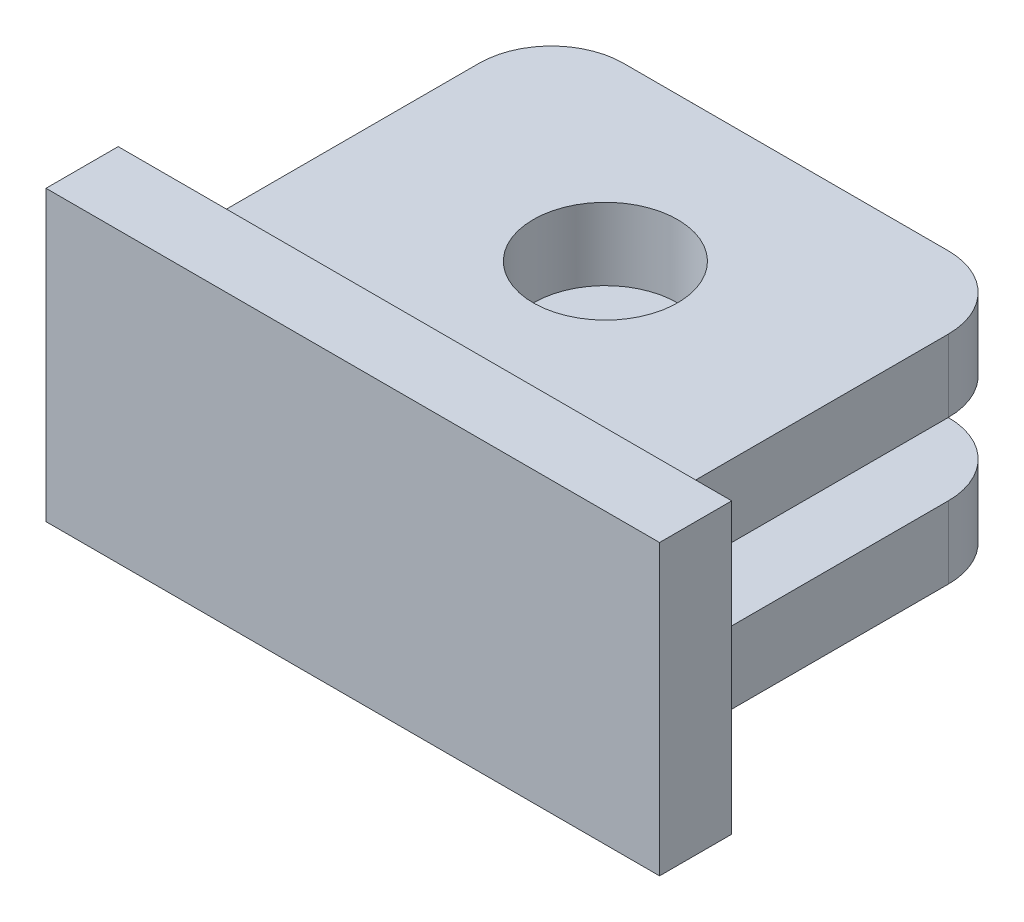
ISO-10303-21;
HEADER;
FILE_DESCRIPTION(('STEP AP214'),'2;1');
FILE_NAME('part.step','',(''),(''),'','','');
FILE_SCHEMA(('AUTOMOTIVE_DESIGN { 1 0 10303 214 1 1 1 1 }'));
ENDSEC;
DATA;
#1=APPLICATION_CONTEXT('core data for automotive mechanical design processes');
#2=APPLICATION_PROTOCOL_DEFINITION('international standard','automotive_design',2000,#1);
#3=PRODUCT_CONTEXT('',#1,'mechanical');
#4=PRODUCT('Part','Part','',(#3));
#5=PRODUCT_RELATED_PRODUCT_CATEGORY('part','',(#4));
#6=PRODUCT_DEFINITION_FORMATION('','',#4);
#7=PRODUCT_DEFINITION_CONTEXT('part definition',#1,'design');
#8=PRODUCT_DEFINITION('design','',#6,#7);
#9=PRODUCT_DEFINITION_SHAPE('','',#8);
#10=(LENGTH_UNIT() NAMED_UNIT(*) SI_UNIT(.MILLI.,.METRE.));
#11=(NAMED_UNIT(*) PLANE_ANGLE_UNIT() SI_UNIT($,.RADIAN.));
#12=(NAMED_UNIT(*) SI_UNIT($,.STERADIAN.) SOLID_ANGLE_UNIT());
#13=UNCERTAINTY_MEASURE_WITH_UNIT(LENGTH_MEASURE(1.E-05),#10,'distance_accuracy_value','');
#14=(GEOMETRIC_REPRESENTATION_CONTEXT(3) GLOBAL_UNCERTAINTY_ASSIGNED_CONTEXT((#13)) GLOBAL_UNIT_ASSIGNED_CONTEXT((#10,
#11,#12)) REPRESENTATION_CONTEXT('',''));
#15=CARTESIAN_POINT('',(0.,0.,0.));
#16=DIRECTION('',(0.,0.,1.));
#17=DIRECTION('',(1.,0.,0.));
#18=AXIS2_PLACEMENT_3D('',#15,#16,#17);
#19=CARTESIAN_POINT('',(0.,0.,0.));
#20=DIRECTION('',(0.,0.,-1.));
#21=DIRECTION('',(-1.,0.,0.));
#22=AXIS2_PLACEMENT_3D('',#19,#20,#21);
#23=PLANE('',#22);
#24=DIRECTION('',(1.,0.,0.));
#25=VECTOR('',#24,1.);
#26=CARTESIAN_POINT('',(170.,80.,0.));
#27=LINE('',#26,#25);
#28=CARTESIAN_POINT('',(0.,80.,0.));
#29=VERTEX_POINT('',#28);
#30=CARTESIAN_POINT('',(170.,80.,0.));
#31=VERTEX_POINT('',#30);
#32=EDGE_CURVE('E146',#29,#31,#27,.T.);
#33=ORIENTED_EDGE('',*,*,#32,.F.);
#34=DIRECTION('',(0.,-1.,0.));
#35=VECTOR('',#34,1.);
#36=CARTESIAN_POINT('',(0.,0.,0.));
#37=LINE('',#36,#35);
#38=CARTESIAN_POINT('',(0.,160.,0.));
#39=VERTEX_POINT('',#38);
#40=EDGE_CURVE('E157',#39,#29,#37,.T.);
#41=ORIENTED_EDGE('',*,*,#40,.F.);
#42=DIRECTION('',(-1.,0.,0.));
#43=VECTOR('',#42,1.);
#44=CARTESIAN_POINT('',(170.,160.,0.));
#45=LINE('',#44,#43);
#46=CARTESIAN_POINT('',(170.,160.,0.));
#47=VERTEX_POINT('',#46);
#48=EDGE_CURVE('E276',#47,#39,#45,.T.);
#49=ORIENTED_EDGE('',*,*,#48,.F.);
#50=DIRECTION('',(0.,1.,0.));
#51=VECTOR('',#50,1.);
#52=CARTESIAN_POINT('',(170.,0.,0.));
#53=LINE('',#52,#51);
#54=EDGE_CURVE('E158',#31,#47,#53,.T.);
#55=ORIENTED_EDGE('',*,*,#54,.F.);
#56=EDGE_LOOP('',(#33,#41,#49,#55));
#57=FACE_BOUND('',#56,.T.);
#58=DIRECTION('',(0.,-1.,0.));
#59=VECTOR('',#58,1.);
#60=CARTESIAN_POINT('',(150.,150.,0.));
#61=LINE('',#60,#59);
#62=CARTESIAN_POINT('',(150.,150.,0.));
#63=VERTEX_POINT('',#62);
#64=CARTESIAN_POINT('',(150.,130.,0.));
#65=VERTEX_POINT('',#64);
#66=EDGE_CURVE('E212',#63,#65,#61,.T.);
#67=ORIENTED_EDGE('',*,*,#66,.F.);
#68=DIRECTION('',(1.,0.,0.));
#69=VECTOR('',#68,1.);
#70=CARTESIAN_POINT('',(20.,150.,0.));
#71=LINE('',#70,#69);
#72=CARTESIAN_POINT('',(20.,150.,0.));
#73=VERTEX_POINT('',#72);
#74=EDGE_CURVE('E191',#73,#63,#71,.T.);
#75=ORIENTED_EDGE('',*,*,#74,.F.);
#76=DIRECTION('',(0.,1.,0.));
#77=VECTOR('',#76,1.);
#78=CARTESIAN_POINT('',(20.,130.,0.));
#79=LINE('',#78,#77);
#80=CARTESIAN_POINT('',(20.,130.,0.));
#81=VERTEX_POINT('',#80);
#82=EDGE_CURVE('E205',#81,#73,#79,.T.);
#83=ORIENTED_EDGE('',*,*,#82,.F.);
#84=DIRECTION('',(-1.,0.,0.));
#85=VECTOR('',#84,1.);
#86=CARTESIAN_POINT('',(150.,130.,0.));
#87=LINE('',#86,#85);
#88=EDGE_CURVE('E209',#65,#81,#87,.T.);
#89=ORIENTED_EDGE('',*,*,#88,.F.);
#90=EDGE_LOOP('',(#67,#75,#83,#89));
#91=FACE_BOUND('',#90,.T.);
#92=DIRECTION('',(-1.,0.,0.));
#93=VECTOR('',#92,1.);
#94=CARTESIAN_POINT('',(150.,110.,0.));
#95=LINE('',#94,#93);
#96=CARTESIAN_POINT('',(150.,110.,0.));
#97=VERTEX_POINT('',#96);
#98=CARTESIAN_POINT('',(20.,110.,0.));
#99=VERTEX_POINT('',#98);
#100=EDGE_CURVE('E254',#97,#99,#95,.T.);
#101=ORIENTED_EDGE('',*,*,#100,.T.);
#102=DIRECTION('',(0.,1.,0.));
#103=VECTOR('',#102,1.);
#104=CARTESIAN_POINT('',(20.,90.,0.));
#105=LINE('',#104,#103);
#106=CARTESIAN_POINT('',(20.,90.,0.));
#107=VERTEX_POINT('',#106);
#108=EDGE_CURVE('E223',#107,#99,#105,.T.);
#109=ORIENTED_EDGE('',*,*,#108,.F.);
#110=DIRECTION('',(-1.,0.,0.));
#111=VECTOR('',#110,1.);
#112=CARTESIAN_POINT('',(150.,90.,0.));
#113=LINE('',#112,#111);
#114=CARTESIAN_POINT('',(150.,90.,0.));
#115=VERTEX_POINT('',#114);
#116=EDGE_CURVE('E245',#115,#107,#113,.T.);
#117=ORIENTED_EDGE('',*,*,#116,.F.);
#118=DIRECTION('',(0.,1.,0.));
#119=VECTOR('',#118,1.);
#120=CARTESIAN_POINT('',(150.,90.,0.));
#121=LINE('',#120,#119);
#122=EDGE_CURVE('E238',#115,#97,#121,.T.);
#123=ORIENTED_EDGE('',*,*,#122,.T.);
#124=EDGE_LOOP('',(#101,#109,#117,#123));
#125=FACE_BOUND('',#124,.T.);
#126=ADVANCED_FACE('F32',(#57,#91,#125),#23,.T.);
#127=CARTESIAN_POINT('',(0.,0.,20.));
#128=DIRECTION('',(1.,0.,0.));
#129=DIRECTION('',(0.,1.,0.));
#130=AXIS2_PLACEMENT_3D('',#127,#128,#129);
#131=PLANE('',#130);
#132=ORIENTED_EDGE('',*,*,#40,.T.);
#133=DIRECTION('',(0.,0.,-1.));
#134=VECTOR('',#133,1.);
#135=CARTESIAN_POINT('',(0.,80.,79.));
#136=LINE('',#135,#134);
#137=CARTESIAN_POINT('',(0.,80.,20.));
#138=VERTEX_POINT('',#137);
#139=EDGE_CURVE('E143',#138,#29,#136,.T.);
#140=ORIENTED_EDGE('',*,*,#139,.F.);
#141=DIRECTION('',(0.,-1.,0.));
#142=VECTOR('',#141,1.);
#143=CARTESIAN_POINT('',(0.,0.,20.));
#144=LINE('',#143,#142);
#145=CARTESIAN_POINT('',(0.,160.,20.));
#146=VERTEX_POINT('',#145);
#147=EDGE_CURVE('E163',#146,#138,#144,.T.);
#148=ORIENTED_EDGE('',*,*,#147,.F.);
#149=DIRECTION('',(0.,0.,-1.));
#150=VECTOR('',#149,1.);
#151=CARTESIAN_POINT('',(0.,160.,79.));
#152=LINE('',#151,#150);
#153=EDGE_CURVE('E54',#146,#39,#152,.T.);
#154=ORIENTED_EDGE('',*,*,#153,.T.);
#155=EDGE_LOOP('',(#132,#140,#148,#154));
#156=FACE_BOUND('',#155,.T.);
#157=ADVANCED_FACE('F160',(#156),#131,.F.);
#158=CARTESIAN_POINT('',(170.,0.,20.));
#159=DIRECTION('',(-1.,0.,0.));
#160=DIRECTION('',(0.,-1.,0.));
#161=AXIS2_PLACEMENT_3D('',#158,#159,#160);
#162=PLANE('',#161);
#163=DIRECTION('',(0.,1.,0.));
#164=VECTOR('',#163,1.);
#165=CARTESIAN_POINT('',(170.,0.,20.));
#166=LINE('',#165,#164);
#167=CARTESIAN_POINT('',(170.,80.,20.));
#168=VERTEX_POINT('',#167);
#169=CARTESIAN_POINT('',(170.,160.,20.));
#170=VERTEX_POINT('',#169);
#171=EDGE_CURVE('E168',#168,#170,#166,.T.);
#172=ORIENTED_EDGE('',*,*,#171,.F.);
#173=DIRECTION('',(0.,0.,-1.));
#174=VECTOR('',#173,1.);
#175=CARTESIAN_POINT('',(170.,80.,79.));
#176=LINE('',#175,#174);
#177=EDGE_CURVE('E47',#168,#31,#176,.T.);
#178=ORIENTED_EDGE('',*,*,#177,.T.);
#179=ORIENTED_EDGE('',*,*,#54,.T.);
#180=DIRECTION('',(0.,0.,-1.));
#181=VECTOR('',#180,1.);
#182=CARTESIAN_POINT('',(170.,160.,79.));
#183=LINE('',#182,#181);
#184=EDGE_CURVE('E274',#170,#47,#183,.T.);
#185=ORIENTED_EDGE('',*,*,#184,.F.);
#186=EDGE_LOOP('',(#172,#178,#179,#185));
#187=FACE_BOUND('',#186,.T.);
#188=ADVANCED_FACE('F280',(#187),#162,.F.);
#189=CARTESIAN_POINT('',(0.,0.,20.));
#190=DIRECTION('',(0.,0.,-1.));
#191=DIRECTION('',(-1.,0.,0.));
#192=AXIS2_PLACEMENT_3D('',#189,#190,#191);
#193=PLANE('',#192);
#194=ORIENTED_EDGE('',*,*,#147,.T.);
#195=DIRECTION('',(1.,0.,0.));
#196=VECTOR('',#195,1.);
#197=CARTESIAN_POINT('',(0.,80.,20.));
#198=LINE('',#197,#196);
#199=EDGE_CURVE('E11',#138,#168,#198,.T.);
#200=ORIENTED_EDGE('',*,*,#199,.T.);
#201=ORIENTED_EDGE('',*,*,#171,.T.);
#202=DIRECTION('',(-1.,0.,0.));
#203=VECTOR('',#202,1.);
#204=CARTESIAN_POINT('',(0.,160.,20.));
#205=LINE('',#204,#203);
#206=EDGE_CURVE('E40',#170,#146,#205,.T.);
#207=ORIENTED_EDGE('',*,*,#206,.T.);
#208=EDGE_LOOP('',(#194,#200,#201,#207));
#209=FACE_BOUND('',#208,.T.);
#210=ADVANCED_FACE('F194',(#209),#193,.F.);
#211=CARTESIAN_POINT('',(20.,150.,-100.));
#212=DIRECTION('',(0.,-1.,0.));
#213=DIRECTION('',(1.,0.,0.));
#214=AXIS2_PLACEMENT_3D('',#211,#212,#213);
#215=PLANE('',#214);
#216=CARTESIAN_POINT('',(85.,150.,-50.));
#217=DIRECTION('',(0.,1.,0.));
#218=DIRECTION('',(-1.,0.,0.));
#219=AXIS2_PLACEMENT_3D('',#216,#217,#218);
#220=CIRCLE('',#219,20.);
#221=CARTESIAN_POINT('',(65.,150.,-50.));
#222=VERTEX_POINT('',#221);
#223=EDGE_CURVE('E192',#222,#222,#220,.T.);
#224=ORIENTED_EDGE('',*,*,#223,.F.);
#225=EDGE_LOOP('',(#224));
#226=FACE_BOUND('',#225,.T.);
#227=DIRECTION('',(1.,0.,0.));
#228=VECTOR('',#227,1.);
#229=CARTESIAN_POINT('',(20.,150.,-100.));
#230=LINE('',#229,#228);
#231=CARTESIAN_POINT('',(40.,150.,-100.));
#232=VERTEX_POINT('',#231);
#233=CARTESIAN_POINT('',(130.,150.,-100.));
#234=VERTEX_POINT('',#233);
#235=EDGE_CURVE('E208',#232,#234,#230,.T.);
#236=ORIENTED_EDGE('',*,*,#235,.F.);
#237=CARTESIAN_POINT('',(40.,150.,-80.));
#238=DIRECTION('',(0.,-1.,0.));
#239=DIRECTION('',(1.,0.,0.));
#240=AXIS2_PLACEMENT_3D('',#237,#238,#239);
#241=CIRCLE('',#240,20.);
#242=CARTESIAN_POINT('',(20.,150.,-80.));
#243=VERTEX_POINT('',#242);
#244=EDGE_CURVE('E179',#232,#243,#241,.F.);
#245=ORIENTED_EDGE('',*,*,#244,.T.);
#246=DIRECTION('',(0.,0.,1.));
#247=VECTOR('',#246,1.);
#248=CARTESIAN_POINT('',(20.,150.,-100.));
#249=LINE('',#248,#247);
#250=EDGE_CURVE('E202',#243,#73,#249,.T.);
#251=ORIENTED_EDGE('',*,*,#250,.T.);
#252=ORIENTED_EDGE('',*,*,#74,.T.);
#253=DIRECTION('',(0.,0.,1.));
#254=VECTOR('',#253,1.);
#255=CARTESIAN_POINT('',(150.,150.,-100.));
#256=LINE('',#255,#254);
#257=CARTESIAN_POINT('',(150.,150.,-80.));
#258=VERTEX_POINT('',#257);
#259=EDGE_CURVE('E161',#258,#63,#256,.T.);
#260=ORIENTED_EDGE('',*,*,#259,.F.);
#261=CARTESIAN_POINT('',(130.,150.,-80.));
#262=DIRECTION('',(0.,-1.,0.));
#263=DIRECTION('',(1.,0.,0.));
#264=AXIS2_PLACEMENT_3D('',#261,#262,#263);
#265=CIRCLE('',#264,20.);
#266=EDGE_CURVE('E177',#258,#234,#265,.F.);
#267=ORIENTED_EDGE('',*,*,#266,.T.);
#268=EDGE_LOOP('',(#236,#245,#251,#252,#260,#267));
#269=FACE_BOUND('',#268,.T.);
#270=ADVANCED_FACE('F339',(#226,#269),#215,.F.);
#271=CARTESIAN_POINT('',(150.,150.,-100.));
#272=DIRECTION('',(-1.,0.,0.));
#273=DIRECTION('',(0.,0.,1.));
#274=AXIS2_PLACEMENT_3D('',#271,#272,#273);
#275=PLANE('',#274);
#276=DIRECTION('',(0.,0.,1.));
#277=VECTOR('',#276,1.);
#278=CARTESIAN_POINT('',(150.,130.,-100.));
#279=LINE('',#278,#277);
#280=CARTESIAN_POINT('',(150.,130.,-80.));
#281=VERTEX_POINT('',#280);
#282=EDGE_CURVE('E165',#281,#65,#279,.T.);
#283=ORIENTED_EDGE('',*,*,#282,.F.);
#284=DIRECTION('',(0.,-1.,0.));
#285=VECTOR('',#284,1.);
#286=CARTESIAN_POINT('',(150.,150.,-80.));
#287=LINE('',#286,#285);
#288=EDGE_CURVE('E187',#281,#258,#287,.F.);
#289=ORIENTED_EDGE('',*,*,#288,.T.);
#290=ORIENTED_EDGE('',*,*,#259,.T.);
#291=ORIENTED_EDGE('',*,*,#66,.T.);
#292=EDGE_LOOP('',(#283,#289,#290,#291));
#293=FACE_BOUND('',#292,.T.);
#294=ADVANCED_FACE('F329',(#293),#275,.F.);
#295=CARTESIAN_POINT('',(150.,130.,-100.));
#296=DIRECTION('',(0.,1.,0.));
#297=DIRECTION('',(0.,0.,1.));
#298=AXIS2_PLACEMENT_3D('',#295,#296,#297);
#299=PLANE('',#298);
#300=CARTESIAN_POINT('',(85.,130.,-50.));
#301=DIRECTION('',(0.,1.,0.));
#302=DIRECTION('',(0.,0.,1.));
#303=AXIS2_PLACEMENT_3D('',#300,#301,#302);
#304=CIRCLE('',#303,20.);
#305=CARTESIAN_POINT('',(85.,130.,-30.));
#306=VERTEX_POINT('',#305);
#307=EDGE_CURVE('E189',#306,#306,#304,.T.);
#308=ORIENTED_EDGE('',*,*,#307,.T.);
#309=EDGE_LOOP('',(#308));
#310=FACE_BOUND('',#309,.T.);
#311=DIRECTION('',(0.,0.,1.));
#312=VECTOR('',#311,1.);
#313=CARTESIAN_POINT('',(20.,130.,-100.));
#314=LINE('',#313,#312);
#315=CARTESIAN_POINT('',(20.,130.,-80.));
#316=VERTEX_POINT('',#315);
#317=EDGE_CURVE('E200',#316,#81,#314,.T.);
#318=ORIENTED_EDGE('',*,*,#317,.F.);
#319=CARTESIAN_POINT('',(40.,130.,-80.));
#320=DIRECTION('',(0.,1.,0.));
#321=DIRECTION('',(0.,0.,1.));
#322=AXIS2_PLACEMENT_3D('',#319,#320,#321);
#323=CIRCLE('',#322,20.);
#324=CARTESIAN_POINT('',(40.,130.,-100.));
#325=VERTEX_POINT('',#324);
#326=EDGE_CURVE('E185',#316,#325,#323,.F.);
#327=ORIENTED_EDGE('',*,*,#326,.T.);
#328=DIRECTION('',(-1.,0.,0.));
#329=VECTOR('',#328,1.);
#330=CARTESIAN_POINT('',(150.,130.,-100.));
#331=LINE('',#330,#329);
#332=CARTESIAN_POINT('',(130.,130.,-100.));
#333=VERTEX_POINT('',#332);
#334=EDGE_CURVE('E204',#333,#325,#331,.T.);
#335=ORIENTED_EDGE('',*,*,#334,.F.);
#336=CARTESIAN_POINT('',(130.,130.,-80.));
#337=DIRECTION('',(0.,1.,0.));
#338=DIRECTION('',(0.,0.,1.));
#339=AXIS2_PLACEMENT_3D('',#336,#337,#338);
#340=CIRCLE('',#339,20.);
#341=EDGE_CURVE('E183',#333,#281,#340,.F.);
#342=ORIENTED_EDGE('',*,*,#341,.T.);
#343=ORIENTED_EDGE('',*,*,#282,.T.);
#344=ORIENTED_EDGE('',*,*,#88,.T.);
#345=EDGE_LOOP('',(#318,#327,#335,#342,#343,#344));
#346=FACE_BOUND('',#345,.T.);
#347=ADVANCED_FACE('F322',(#310,#346),#299,.F.);
#348=CARTESIAN_POINT('',(20.,130.,-100.));
#349=DIRECTION('',(1.,0.,0.));
#350=DIRECTION('',(0.,0.,-1.));
#351=AXIS2_PLACEMENT_3D('',#348,#349,#350);
#352=PLANE('',#351);
#353=ORIENTED_EDGE('',*,*,#250,.F.);
#354=DIRECTION('',(0.,1.,0.));
#355=VECTOR('',#354,1.);
#356=CARTESIAN_POINT('',(20.,130.,-80.));
#357=LINE('',#356,#355);
#358=EDGE_CURVE('E181',#243,#316,#357,.F.);
#359=ORIENTED_EDGE('',*,*,#358,.T.);
#360=ORIENTED_EDGE('',*,*,#317,.T.);
#361=ORIENTED_EDGE('',*,*,#82,.T.);
#362=EDGE_LOOP('',(#353,#359,#360,#361));
#363=FACE_BOUND('',#362,.T.);
#364=ADVANCED_FACE('F313',(#363),#352,.F.);
#365=CARTESIAN_POINT('',(0.,0.,-100.));
#366=DIRECTION('',(0.,0.,-1.));
#367=DIRECTION('',(-1.,0.,0.));
#368=AXIS2_PLACEMENT_3D('',#365,#366,#367);
#369=PLANE('',#368);
#370=ORIENTED_EDGE('',*,*,#334,.T.);
#371=DIRECTION('',(0.,1.,0.));
#372=VECTOR('',#371,1.);
#373=CARTESIAN_POINT('',(40.,150.,-100.));
#374=LINE('',#373,#372);
#375=EDGE_CURVE('E174',#325,#232,#374,.T.);
#376=ORIENTED_EDGE('',*,*,#375,.T.);
#377=ORIENTED_EDGE('',*,*,#235,.T.);
#378=DIRECTION('',(0.,-1.,0.));
#379=VECTOR('',#378,1.);
#380=CARTESIAN_POINT('',(130.,130.,-100.));
#381=LINE('',#380,#379);
#382=EDGE_CURVE('E171',#234,#333,#381,.T.);
#383=ORIENTED_EDGE('',*,*,#382,.T.);
#384=EDGE_LOOP('',(#370,#376,#377,#383));
#385=FACE_BOUND('',#384,.T.);
#386=ADVANCED_FACE('F305',(#385),#369,.T.);
#387=CARTESIAN_POINT('',(40.,0.,-80.));
#388=DIRECTION('',(0.,-1.,0.));
#389=DIRECTION('',(0.,0.,-1.));
#390=AXIS2_PLACEMENT_3D('',#387,#388,#389);
#391=CYLINDRICAL_SURFACE('',#390,20.);
#392=ORIENTED_EDGE('',*,*,#326,.F.);
#393=ORIENTED_EDGE('',*,*,#358,.F.);
#394=ORIENTED_EDGE('',*,*,#244,.F.);
#395=ORIENTED_EDGE('',*,*,#375,.F.);
#396=EDGE_LOOP('',(#392,#393,#394,#395));
#397=FACE_BOUND('',#396,.T.);
#398=ADVANCED_FACE('F303',(#397),#391,.T.);
#399=CARTESIAN_POINT('',(130.,0.,-80.));
#400=DIRECTION('',(0.,1.,0.));
#401=DIRECTION('',(0.,0.,1.));
#402=AXIS2_PLACEMENT_3D('',#399,#400,#401);
#403=CYLINDRICAL_SURFACE('',#402,20.);
#404=ORIENTED_EDGE('',*,*,#266,.F.);
#405=ORIENTED_EDGE('',*,*,#288,.F.);
#406=ORIENTED_EDGE('',*,*,#341,.F.);
#407=ORIENTED_EDGE('',*,*,#382,.F.);
#408=EDGE_LOOP('',(#404,#405,#406,#407));
#409=FACE_BOUND('',#408,.T.);
#410=ADVANCED_FACE('F34',(#409),#403,.T.);
#411=CARTESIAN_POINT('',(85.,50.,-50.));
#412=DIRECTION('',(0.,1.,0.));
#413=DIRECTION('',(-1.,0.,0.));
#414=AXIS2_PLACEMENT_3D('',#411,#412,#413);
#415=CYLINDRICAL_SURFACE('',#414,20.);
#416=ORIENTED_EDGE('',*,*,#223,.T.);
#417=EDGE_LOOP('',(#416));
#418=FACE_BOUND('',#417,.T.);
#419=ORIENTED_EDGE('',*,*,#307,.F.);
#420=EDGE_LOOP('',(#419));
#421=FACE_BOUND('',#420,.T.);
#422=ADVANCED_FACE('F311',(#418,#421),#415,.F.);
#423=CARTESIAN_POINT('',(40.,90.,-80.));
#424=DIRECTION('',(0.,-1.,0.));
#425=DIRECTION('',(0.,0.,-1.));
#426=AXIS2_PLACEMENT_3D('',#423,#424,#425);
#427=PLANE('',#426);
#428=ORIENTED_EDGE('',*,*,#116,.T.);
#429=DIRECTION('',(0.,0.,-1.));
#430=VECTOR('',#429,1.);
#431=CARTESIAN_POINT('',(20.,90.,0.));
#432=LINE('',#431,#430);
#433=CARTESIAN_POINT('',(20.,90.,-80.));
#434=VERTEX_POINT('',#433);
#435=EDGE_CURVE('E265',#107,#434,#432,.T.);
#436=ORIENTED_EDGE('',*,*,#435,.T.);
#437=CARTESIAN_POINT('',(40.,90.,-80.));
#438=DIRECTION('',(0.,-1.,0.));
#439=DIRECTION('',(0.,0.,-1.));
#440=AXIS2_PLACEMENT_3D('',#437,#438,#439);
#441=CIRCLE('',#440,20.);
#442=CARTESIAN_POINT('',(40.,90.,-100.));
#443=VERTEX_POINT('',#442);
#444=EDGE_CURVE('E263',#434,#443,#441,.T.);
#445=ORIENTED_EDGE('',*,*,#444,.T.);
#446=DIRECTION('',(1.,0.,0.));
#447=VECTOR('',#446,1.);
#448=CARTESIAN_POINT('',(40.,90.,-100.));
#449=LINE('',#448,#447);
#450=CARTESIAN_POINT('',(130.,90.,-100.));
#451=VERTEX_POINT('',#450);
#452=EDGE_CURVE('E261',#443,#451,#449,.T.);
#453=ORIENTED_EDGE('',*,*,#452,.T.);
#454=CARTESIAN_POINT('',(130.,90.,-80.));
#455=DIRECTION('',(0.,-1.,0.));
#456=DIRECTION('',(0.,0.,-1.));
#457=AXIS2_PLACEMENT_3D('',#454,#455,#456);
#458=CIRCLE('',#457,20.);
#459=CARTESIAN_POINT('',(150.,90.,-80.));
#460=VERTEX_POINT('',#459);
#461=EDGE_CURVE('E259',#451,#460,#458,.T.);
#462=ORIENTED_EDGE('',*,*,#461,.T.);
#463=DIRECTION('',(0.,0.,1.));
#464=VECTOR('',#463,1.);
#465=CARTESIAN_POINT('',(150.,90.,-80.));
#466=LINE('',#465,#464);
#467=EDGE_CURVE('E241',#460,#115,#466,.T.);
#468=ORIENTED_EDGE('',*,*,#467,.T.);
#469=EDGE_LOOP('',(#428,#436,#445,#453,#462,#468));
#470=FACE_BOUND('',#469,.T.);
#471=CARTESIAN_POINT('',(85.,90.,-50.));
#472=DIRECTION('',(0.,-1.,0.));
#473=DIRECTION('',(0.,0.,-1.));
#474=AXIS2_PLACEMENT_3D('',#471,#472,#473);
#475=CIRCLE('',#474,20.);
#476=CARTESIAN_POINT('',(85.,90.,-70.));
#477=VERTEX_POINT('',#476);
#478=EDGE_CURVE('E257',#477,#477,#475,.T.);
#479=ORIENTED_EDGE('',*,*,#478,.F.);
#480=EDGE_LOOP('',(#479));
#481=FACE_BOUND('',#480,.T.);
#482=ADVANCED_FACE('F356',(#470,#481),#427,.T.);
#483=CARTESIAN_POINT('',(40.,110.,-80.));
#484=DIRECTION('',(0.,-1.,0.));
#485=DIRECTION('',(0.,0.,-1.));
#486=AXIS2_PLACEMENT_3D('',#483,#484,#485);
#487=PLANE('',#486);
#488=ORIENTED_EDGE('',*,*,#100,.F.);
#489=DIRECTION('',(0.,0.,1.));
#490=VECTOR('',#489,1.);
#491=CARTESIAN_POINT('',(150.,110.,-80.));
#492=LINE('',#491,#490);
#493=CARTESIAN_POINT('',(150.,110.,-80.));
#494=VERTEX_POINT('',#493);
#495=EDGE_CURVE('E242',#494,#97,#492,.T.);
#496=ORIENTED_EDGE('',*,*,#495,.F.);
#497=CARTESIAN_POINT('',(130.,110.,-80.));
#498=DIRECTION('',(0.,-1.,0.));
#499=DIRECTION('',(0.,0.,-1.));
#500=AXIS2_PLACEMENT_3D('',#497,#498,#499);
#501=CIRCLE('',#500,20.);
#502=CARTESIAN_POINT('',(130.,110.,-100.));
#503=VERTEX_POINT('',#502);
#504=EDGE_CURVE('E246',#503,#494,#501,.T.);
#505=ORIENTED_EDGE('',*,*,#504,.F.);
#506=DIRECTION('',(1.,0.,0.));
#507=VECTOR('',#506,1.);
#508=CARTESIAN_POINT('',(40.,110.,-100.));
#509=LINE('',#508,#507);
#510=CARTESIAN_POINT('',(40.,110.,-100.));
#511=VERTEX_POINT('',#510);
#512=EDGE_CURVE('E248',#511,#503,#509,.T.);
#513=ORIENTED_EDGE('',*,*,#512,.F.);
#514=CARTESIAN_POINT('',(40.,110.,-80.));
#515=DIRECTION('',(0.,-1.,0.));
#516=DIRECTION('',(0.,0.,-1.));
#517=AXIS2_PLACEMENT_3D('',#514,#515,#516);
#518=CIRCLE('',#517,20.);
#519=CARTESIAN_POINT('',(20.,110.,-80.));
#520=VERTEX_POINT('',#519);
#521=EDGE_CURVE('E250',#520,#511,#518,.T.);
#522=ORIENTED_EDGE('',*,*,#521,.F.);
#523=DIRECTION('',(0.,0.,-1.));
#524=VECTOR('',#523,1.);
#525=CARTESIAN_POINT('',(20.,110.,0.));
#526=LINE('',#525,#524);
#527=EDGE_CURVE('E252',#99,#520,#526,.T.);
#528=ORIENTED_EDGE('',*,*,#527,.F.);
#529=EDGE_LOOP('',(#488,#496,#505,#513,#522,#528));
#530=FACE_BOUND('',#529,.T.);
#531=CARTESIAN_POINT('',(85.,110.,-50.));
#532=DIRECTION('',(0.,-1.,0.));
#533=DIRECTION('',(0.,0.,-1.));
#534=AXIS2_PLACEMENT_3D('',#531,#532,#533);
#535=CIRCLE('',#534,20.);
#536=CARTESIAN_POINT('',(85.,110.,-70.));
#537=VERTEX_POINT('',#536);
#538=EDGE_CURVE('E269',#537,#537,#535,.T.);
#539=ORIENTED_EDGE('',*,*,#538,.T.);
#540=EDGE_LOOP('',(#539));
#541=FACE_BOUND('',#540,.T.);
#542=ADVANCED_FACE('F362',(#530,#541),#487,.F.);
#543=CARTESIAN_POINT('',(20.,90.,0.));
#544=DIRECTION('',(1.,0.,0.));
#545=DIRECTION('',(0.,0.,-1.));
#546=AXIS2_PLACEMENT_3D('',#543,#544,#545);
#547=PLANE('',#546);
#548=ORIENTED_EDGE('',*,*,#527,.T.);
#549=DIRECTION('',(0.,1.,0.));
#550=VECTOR('',#549,1.);
#551=CARTESIAN_POINT('',(20.,90.,-80.));
#552=LINE('',#551,#550);
#553=EDGE_CURVE('E226',#434,#520,#552,.T.);
#554=ORIENTED_EDGE('',*,*,#553,.F.);
#555=ORIENTED_EDGE('',*,*,#435,.F.);
#556=ORIENTED_EDGE('',*,*,#108,.T.);
#557=EDGE_LOOP('',(#548,#554,#555,#556));
#558=FACE_BOUND('',#557,.T.);
#559=ADVANCED_FACE('F358',(#558),#547,.F.);
#560=CARTESIAN_POINT('',(40.,90.,-80.));
#561=DIRECTION('',(0.,1.,0.));
#562=DIRECTION('',(0.,0.,1.));
#563=AXIS2_PLACEMENT_3D('',#560,#561,#562);
#564=CYLINDRICAL_SURFACE('',#563,20.);
#565=ORIENTED_EDGE('',*,*,#521,.T.);
#566=DIRECTION('',(0.,1.,0.));
#567=VECTOR('',#566,1.);
#568=CARTESIAN_POINT('',(40.,90.,-100.));
#569=LINE('',#568,#567);
#570=EDGE_CURVE('E229',#443,#511,#569,.T.);
#571=ORIENTED_EDGE('',*,*,#570,.F.);
#572=ORIENTED_EDGE('',*,*,#444,.F.);
#573=ORIENTED_EDGE('',*,*,#553,.T.);
#574=EDGE_LOOP('',(#565,#571,#572,#573));
#575=FACE_BOUND('',#574,.T.);
#576=ADVANCED_FACE('F361',(#575),#564,.T.);
#577=CARTESIAN_POINT('',(40.,90.,-100.));
#578=DIRECTION('',(0.,0.,1.));
#579=DIRECTION('',(1.,0.,0.));
#580=AXIS2_PLACEMENT_3D('',#577,#578,#579);
#581=PLANE('',#580);
#582=ORIENTED_EDGE('',*,*,#512,.T.);
#583=DIRECTION('',(0.,1.,0.));
#584=VECTOR('',#583,1.);
#585=CARTESIAN_POINT('',(130.,90.,-100.));
#586=LINE('',#585,#584);
#587=EDGE_CURVE('E232',#451,#503,#586,.T.);
#588=ORIENTED_EDGE('',*,*,#587,.F.);
#589=ORIENTED_EDGE('',*,*,#452,.F.);
#590=ORIENTED_EDGE('',*,*,#570,.T.);
#591=EDGE_LOOP('',(#582,#588,#589,#590));
#592=FACE_BOUND('',#591,.T.);
#593=ADVANCED_FACE('F366',(#592),#581,.F.);
#594=CARTESIAN_POINT('',(130.,90.,-80.));
#595=DIRECTION('',(0.,1.,0.));
#596=DIRECTION('',(0.,0.,1.));
#597=AXIS2_PLACEMENT_3D('',#594,#595,#596);
#598=CYLINDRICAL_SURFACE('',#597,20.);
#599=ORIENTED_EDGE('',*,*,#504,.T.);
#600=DIRECTION('',(0.,1.,0.));
#601=VECTOR('',#600,1.);
#602=CARTESIAN_POINT('',(150.,90.,-80.));
#603=LINE('',#602,#601);
#604=EDGE_CURVE('E235',#460,#494,#603,.T.);
#605=ORIENTED_EDGE('',*,*,#604,.F.);
#606=ORIENTED_EDGE('',*,*,#461,.F.);
#607=ORIENTED_EDGE('',*,*,#587,.T.);
#608=EDGE_LOOP('',(#599,#605,#606,#607));
#609=FACE_BOUND('',#608,.T.);
#610=ADVANCED_FACE('F370',(#609),#598,.T.);
#611=CARTESIAN_POINT('',(150.,90.,-80.));
#612=DIRECTION('',(-1.,0.,0.));
#613=DIRECTION('',(0.,0.,1.));
#614=AXIS2_PLACEMENT_3D('',#611,#612,#613);
#615=PLANE('',#614);
#616=ORIENTED_EDGE('',*,*,#495,.T.);
#617=ORIENTED_EDGE('',*,*,#122,.F.);
#618=ORIENTED_EDGE('',*,*,#467,.F.);
#619=ORIENTED_EDGE('',*,*,#604,.T.);
#620=EDGE_LOOP('',(#616,#617,#618,#619));
#621=FACE_BOUND('',#620,.T.);
#622=ADVANCED_FACE('F290',(#621),#615,.F.);
#623=CARTESIAN_POINT('',(85.,90.,-50.));
#624=DIRECTION('',(0.,1.,0.));
#625=DIRECTION('',(0.,0.,1.));
#626=AXIS2_PLACEMENT_3D('',#623,#624,#625);
#627=CYLINDRICAL_SURFACE('',#626,20.);
#628=ORIENTED_EDGE('',*,*,#478,.T.);
#629=EDGE_LOOP('',(#628));
#630=FACE_BOUND('',#629,.T.);
#631=ORIENTED_EDGE('',*,*,#538,.F.);
#632=EDGE_LOOP('',(#631));
#633=FACE_BOUND('',#632,.T.);
#634=ADVANCED_FACE('F283',(#630,#633),#627,.F.);
#635=CARTESIAN_POINT('',(170.,160.,79.));
#636=DIRECTION('',(0.,-1.,0.));
#637=DIRECTION('',(0.,0.,-1.));
#638=AXIS2_PLACEMENT_3D('',#635,#636,#637);
#639=PLANE('',#638);
#640=ORIENTED_EDGE('',*,*,#184,.T.);
#641=ORIENTED_EDGE('',*,*,#48,.T.);
#642=ORIENTED_EDGE('',*,*,#153,.F.);
#643=ORIENTED_EDGE('',*,*,#206,.F.);
#644=EDGE_LOOP('',(#640,#641,#642,#643));
#645=FACE_BOUND('',#644,.T.);
#646=ADVANCED_FACE('F281',(#645),#639,.F.);
#647=CARTESIAN_POINT('',(170.,80.,79.));
#648=DIRECTION('',(0.,1.,0.));
#649=DIRECTION('',(0.,0.,1.));
#650=AXIS2_PLACEMENT_3D('',#647,#648,#649);
#651=PLANE('',#650);
#652=ORIENTED_EDGE('',*,*,#139,.T.);
#653=ORIENTED_EDGE('',*,*,#32,.T.);
#654=ORIENTED_EDGE('',*,*,#177,.F.);
#655=ORIENTED_EDGE('',*,*,#199,.F.);
#656=EDGE_LOOP('',(#652,#653,#654,#655));
#657=FACE_BOUND('',#656,.T.);
#658=ADVANCED_FACE('F145',(#657),#651,.F.);
#659=CLOSED_SHELL('',(#126,#157,#188,#210,#270,#294,#347,#364,#386,#398,#410,#422,#482,#542,
#559,#576,#593,#610,#622,#634,#646,#658));
#660=MANIFOLD_SOLID_BREP('B2',#659);
#661=ADVANCED_BREP_SHAPE_REPRESENTATION('',(#18,#660),#14);
#662=SHAPE_DEFINITION_REPRESENTATION(#9,#661);
ENDSEC;
END-ISO-10303-21;
